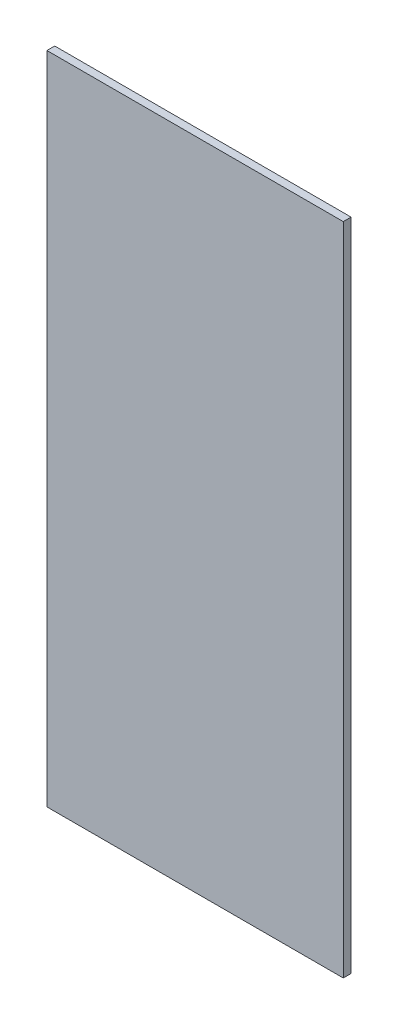
ISO-10303-21;
HEADER;
FILE_DESCRIPTION(('STEP AP214'),'2;1');
FILE_NAME('part.step','',(''),(''),'','','');
FILE_SCHEMA(('AUTOMOTIVE_DESIGN { 1 0 10303 214 1 1 1 1 }'));
ENDSEC;
DATA;
#1=APPLICATION_CONTEXT('core data for automotive mechanical design processes');
#2=APPLICATION_PROTOCOL_DEFINITION('international standard','automotive_design',2000,#1);
#3=PRODUCT_CONTEXT('',#1,'mechanical');
#4=PRODUCT('Part','Part','',(#3));
#5=PRODUCT_RELATED_PRODUCT_CATEGORY('part','',(#4));
#6=PRODUCT_DEFINITION_FORMATION('','',#4);
#7=PRODUCT_DEFINITION_CONTEXT('part definition',#1,'design');
#8=PRODUCT_DEFINITION('design','',#6,#7);
#9=PRODUCT_DEFINITION_SHAPE('','',#8);
#10=(LENGTH_UNIT() NAMED_UNIT(*) SI_UNIT(.MILLI.,.METRE.));
#11=(NAMED_UNIT(*) PLANE_ANGLE_UNIT() SI_UNIT($,.RADIAN.));
#12=(NAMED_UNIT(*) SI_UNIT($,.STERADIAN.) SOLID_ANGLE_UNIT());
#13=UNCERTAINTY_MEASURE_WITH_UNIT(LENGTH_MEASURE(1.E-05),#10,'distance_accuracy_value','');
#14=(GEOMETRIC_REPRESENTATION_CONTEXT(3) GLOBAL_UNCERTAINTY_ASSIGNED_CONTEXT((#13)) GLOBAL_UNIT_ASSIGNED_CONTEXT((#10,
#11,#12)) REPRESENTATION_CONTEXT('',''));
#15=CARTESIAN_POINT('',(0.,0.,0.));
#16=DIRECTION('',(0.,0.,1.));
#17=DIRECTION('',(1.,0.,0.));
#18=AXIS2_PLACEMENT_3D('',#15,#16,#17);
#19=CARTESIAN_POINT('',(94.9999999999999,210.,5.));
#20=DIRECTION('',(-1.,0.,0.));
#21=DIRECTION('',(0.,-1.,0.));
#22=AXIS2_PLACEMENT_3D('',#19,#20,#21);
#23=PLANE('',#22);
#24=DIRECTION('',(0.,1.,0.));
#25=VECTOR('',#24,1.);
#26=CARTESIAN_POINT('',(94.9999999999999,210.,0.));
#27=LINE('',#26,#25);
#28=CARTESIAN_POINT('',(95.,-210.,0.));
#29=VERTEX_POINT('',#28);
#30=CARTESIAN_POINT('',(94.9999999999999,210.,0.));
#31=VERTEX_POINT('',#30);
#32=EDGE_CURVE('E96',#29,#31,#27,.T.);
#33=ORIENTED_EDGE('',*,*,#32,.T.);
#34=DIRECTION('',(0.,0.,-1.));
#35=VECTOR('',#34,1.);
#36=CARTESIAN_POINT('',(94.9999999999999,210.,5.));
#37=LINE('',#36,#35);
#38=CARTESIAN_POINT('',(94.9999999999999,210.,5.));
#39=VERTEX_POINT('',#38);
#40=EDGE_CURVE('E11',#39,#31,#37,.T.);
#41=ORIENTED_EDGE('',*,*,#40,.F.);
#42=DIRECTION('',(0.,1.,0.));
#43=VECTOR('',#42,1.);
#44=CARTESIAN_POINT('',(94.9999999999999,210.,5.));
#45=LINE('',#44,#43);
#46=CARTESIAN_POINT('',(95.,-210.,5.));
#47=VERTEX_POINT('',#46);
#48=EDGE_CURVE('E84',#47,#39,#45,.T.);
#49=ORIENTED_EDGE('',*,*,#48,.F.);
#50=DIRECTION('',(0.,0.,-1.));
#51=VECTOR('',#50,1.);
#52=CARTESIAN_POINT('',(95.,-210.,5.));
#53=LINE('',#52,#51);
#54=EDGE_CURVE('E92',#47,#29,#53,.T.);
#55=ORIENTED_EDGE('',*,*,#54,.T.);
#56=EDGE_LOOP('',(#33,#41,#49,#55));
#57=FACE_BOUND('',#56,.T.);
#58=ADVANCED_FACE('F33',(#57),#23,.F.);
#59=CARTESIAN_POINT('',(-95.0000000000001,210.,5.));
#60=DIRECTION('',(0.,-1.,0.));
#61=DIRECTION('',(0.,0.,-1.));
#62=AXIS2_PLACEMENT_3D('',#59,#60,#61);
#63=PLANE('',#62);
#64=DIRECTION('',(-1.,0.,0.));
#65=VECTOR('',#64,1.);
#66=CARTESIAN_POINT('',(-95.0000000000001,210.,0.));
#67=LINE('',#66,#65);
#68=CARTESIAN_POINT('',(-95.0000000000001,210.,0.));
#69=VERTEX_POINT('',#68);
#70=EDGE_CURVE('E88',#31,#69,#67,.T.);
#71=ORIENTED_EDGE('',*,*,#70,.T.);
#72=DIRECTION('',(0.,0.,-1.));
#73=VECTOR('',#72,1.);
#74=CARTESIAN_POINT('',(-95.0000000000001,210.,5.));
#75=LINE('',#74,#73);
#76=CARTESIAN_POINT('',(-95.0000000000001,210.,5.));
#77=VERTEX_POINT('',#76);
#78=EDGE_CURVE('E41',#77,#69,#75,.T.);
#79=ORIENTED_EDGE('',*,*,#78,.F.);
#80=DIRECTION('',(-1.,0.,0.));
#81=VECTOR('',#80,1.);
#82=CARTESIAN_POINT('',(-95.0000000000001,210.,5.));
#83=LINE('',#82,#81);
#84=EDGE_CURVE('E79',#39,#77,#83,.T.);
#85=ORIENTED_EDGE('',*,*,#84,.F.);
#86=ORIENTED_EDGE('',*,*,#40,.T.);
#87=EDGE_LOOP('',(#71,#79,#85,#86));
#88=FACE_BOUND('',#87,.T.);
#89=ADVANCED_FACE('F87',(#88),#63,.F.);
#90=CARTESIAN_POINT('',(-95.0000000000001,210.,5.));
#91=DIRECTION('',(1.,0.,0.));
#92=DIRECTION('',(0.,1.,0.));
#93=AXIS2_PLACEMENT_3D('',#90,#91,#92);
#94=PLANE('',#93);
#95=DIRECTION('',(0.,-1.,0.));
#96=VECTOR('',#95,1.);
#97=CARTESIAN_POINT('',(-95.0000000000001,210.,0.));
#98=LINE('',#97,#96);
#99=CARTESIAN_POINT('',(-95.,-210.,0.));
#100=VERTEX_POINT('',#99);
#101=EDGE_CURVE('E66',#69,#100,#98,.T.);
#102=ORIENTED_EDGE('',*,*,#101,.T.);
#103=DIRECTION('',(0.,0.,-1.));
#104=VECTOR('',#103,1.);
#105=CARTESIAN_POINT('',(-95.,-210.,5.));
#106=LINE('',#105,#104);
#107=CARTESIAN_POINT('',(-95.,-210.,5.));
#108=VERTEX_POINT('',#107);
#109=EDGE_CURVE('E89',#108,#100,#106,.T.);
#110=ORIENTED_EDGE('',*,*,#109,.F.);
#111=DIRECTION('',(0.,-1.,0.));
#112=VECTOR('',#111,1.);
#113=CARTESIAN_POINT('',(-95.0000000000001,210.,5.));
#114=LINE('',#113,#112);
#115=EDGE_CURVE('E82',#77,#108,#114,.T.);
#116=ORIENTED_EDGE('',*,*,#115,.F.);
#117=ORIENTED_EDGE('',*,*,#78,.T.);
#118=EDGE_LOOP('',(#102,#110,#116,#117));
#119=FACE_BOUND('',#118,.T.);
#120=ADVANCED_FACE('F90',(#119),#94,.F.);
#121=CARTESIAN_POINT('',(-95.,-210.,5.));
#122=DIRECTION('',(0.,1.,0.));
#123=DIRECTION('',(0.,0.,1.));
#124=AXIS2_PLACEMENT_3D('',#121,#122,#123);
#125=PLANE('',#124);
#126=DIRECTION('',(1.,0.,0.));
#127=VECTOR('',#126,1.);
#128=CARTESIAN_POINT('',(-95.,-210.,0.));
#129=LINE('',#128,#127);
#130=EDGE_CURVE('E72',#100,#29,#129,.T.);
#131=ORIENTED_EDGE('',*,*,#130,.T.);
#132=ORIENTED_EDGE('',*,*,#54,.F.);
#133=DIRECTION('',(1.,0.,0.));
#134=VECTOR('',#133,1.);
#135=CARTESIAN_POINT('',(-95.,-210.,5.));
#136=LINE('',#135,#134);
#137=EDGE_CURVE('E49',#108,#47,#136,.T.);
#138=ORIENTED_EDGE('',*,*,#137,.F.);
#139=ORIENTED_EDGE('',*,*,#109,.T.);
#140=EDGE_LOOP('',(#131,#132,#138,#139));
#141=FACE_BOUND('',#140,.T.);
#142=ADVANCED_FACE('F103',(#141),#125,.F.);
#143=CARTESIAN_POINT('',(0.,0.,5.));
#144=DIRECTION('',(0.,0.,1.));
#145=DIRECTION('',(1.,0.,0.));
#146=AXIS2_PLACEMENT_3D('',#143,#144,#145);
#147=PLANE('',#146);
#148=ORIENTED_EDGE('',*,*,#48,.T.);
#149=ORIENTED_EDGE('',*,*,#84,.T.);
#150=ORIENTED_EDGE('',*,*,#115,.T.);
#151=ORIENTED_EDGE('',*,*,#137,.T.);
#152=EDGE_LOOP('',(#148,#149,#150,#151));
#153=FACE_BOUND('',#152,.T.);
#154=ADVANCED_FACE('F80',(#153),#147,.T.);
#155=CARTESIAN_POINT('',(0.,0.,0.));
#156=DIRECTION('',(0.,0.,1.));
#157=DIRECTION('',(1.,0.,0.));
#158=AXIS2_PLACEMENT_3D('',#155,#156,#157);
#159=PLANE('',#158);
#160=ORIENTED_EDGE('',*,*,#32,.F.);
#161=ORIENTED_EDGE('',*,*,#130,.F.);
#162=ORIENTED_EDGE('',*,*,#101,.F.);
#163=ORIENTED_EDGE('',*,*,#70,.F.);
#164=EDGE_LOOP('',(#160,#161,#162,#163));
#165=FACE_BOUND('',#164,.T.);
#166=ADVANCED_FACE('F106',(#165),#159,.F.);
#167=CLOSED_SHELL('',(#58,#89,#120,#142,#154,#166));
#168=MANIFOLD_SOLID_BREP('B2',#167);
#169=ADVANCED_BREP_SHAPE_REPRESENTATION('',(#18,#168),#14);
#170=SHAPE_DEFINITION_REPRESENTATION(#9,#169);
ENDSEC;
END-ISO-10303-21;
